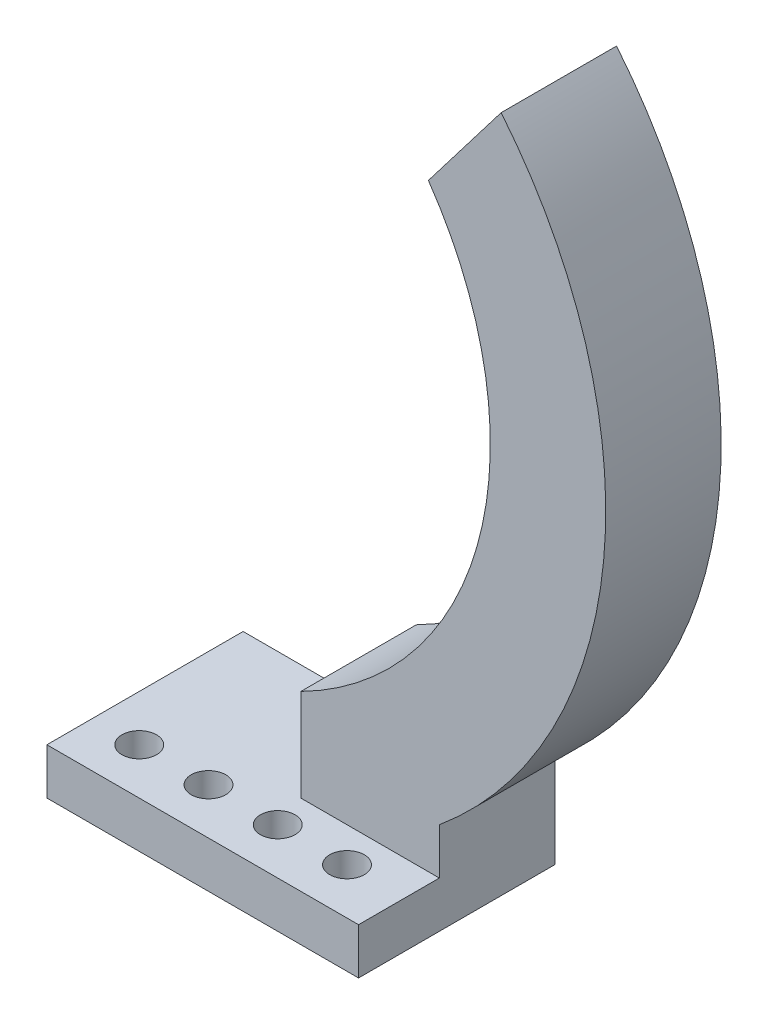
ISO-10303-21;
HEADER;
FILE_DESCRIPTION(('STEP AP214'),'2;1');
FILE_NAME('part.step','',(''),(''),'','','');
FILE_SCHEMA(('AUTOMOTIVE_DESIGN { 1 0 10303 214 1 1 1 1 }'));
ENDSEC;
DATA;
#1=APPLICATION_CONTEXT('core data for automotive mechanical design processes');
#2=APPLICATION_PROTOCOL_DEFINITION('international standard','automotive_design',2000,#1);
#3=PRODUCT_CONTEXT('',#1,'mechanical');
#4=PRODUCT('Part','Part','',(#3));
#5=PRODUCT_RELATED_PRODUCT_CATEGORY('part','',(#4));
#6=PRODUCT_DEFINITION_FORMATION('','',#4);
#7=PRODUCT_DEFINITION_CONTEXT('part definition',#1,'design');
#8=PRODUCT_DEFINITION('design','',#6,#7);
#9=PRODUCT_DEFINITION_SHAPE('','',#8);
#10=(LENGTH_UNIT() NAMED_UNIT(*) SI_UNIT(.MILLI.,.METRE.));
#11=(NAMED_UNIT(*) PLANE_ANGLE_UNIT() SI_UNIT($,.RADIAN.));
#12=(NAMED_UNIT(*) SI_UNIT($,.STERADIAN.) SOLID_ANGLE_UNIT());
#13=UNCERTAINTY_MEASURE_WITH_UNIT(LENGTH_MEASURE(1.E-05),#10,'distance_accuracy_value','');
#14=(GEOMETRIC_REPRESENTATION_CONTEXT(3) GLOBAL_UNCERTAINTY_ASSIGNED_CONTEXT((#13)) GLOBAL_UNIT_ASSIGNED_CONTEXT((#10,
#11,#12)) REPRESENTATION_CONTEXT('',''));
#15=CARTESIAN_POINT('',(0.,0.,0.));
#16=DIRECTION('',(0.,0.,1.));
#17=DIRECTION('',(1.,0.,0.));
#18=AXIS2_PLACEMENT_3D('',#15,#16,#17);
#19=CARTESIAN_POINT('',(0.,0.,10.));
#20=DIRECTION('',(0.,1.,0.));
#21=DIRECTION('',(0.,0.,1.));
#22=AXIS2_PLACEMENT_3D('',#19,#20,#21);
#23=PLANE('',#22);
#24=CARTESIAN_POINT('',(31.,0.,13.));
#25=DIRECTION('',(0.,-1.,0.));
#26=DIRECTION('',(0.,0.,1.));
#27=AXIS2_PLACEMENT_3D('',#24,#25,#26);
#28=CIRCLE('',#27,1.5);
#29=CARTESIAN_POINT('',(31.,0.,14.5));
#30=VERTEX_POINT('',#29);
#31=EDGE_CURVE('E219',#30,#30,#28,.T.);
#32=ORIENTED_EDGE('',*,*,#31,.F.);
#33=EDGE_LOOP('',(#32));
#34=FACE_BOUND('',#33,.T.);
#35=CARTESIAN_POINT('',(37.,0.,13.));
#36=DIRECTION('',(0.,-1.,0.));
#37=DIRECTION('',(0.,0.,1.));
#38=AXIS2_PLACEMENT_3D('',#35,#36,#37);
#39=CIRCLE('',#38,1.5);
#40=CARTESIAN_POINT('',(37.,0.,14.5));
#41=VERTEX_POINT('',#40);
#42=EDGE_CURVE('E213',#41,#41,#39,.T.);
#43=ORIENTED_EDGE('',*,*,#42,.F.);
#44=EDGE_LOOP('',(#43));
#45=FACE_BOUND('',#44,.T.);
#46=CARTESIAN_POINT('',(43.,0.,13.));
#47=DIRECTION('',(0.,-1.,0.));
#48=DIRECTION('',(0.,0.,1.));
#49=AXIS2_PLACEMENT_3D('',#46,#47,#48);
#50=CIRCLE('',#49,1.5);
#51=CARTESIAN_POINT('',(43.,0.,14.5));
#52=VERTEX_POINT('',#51);
#53=EDGE_CURVE('E207',#52,#52,#50,.T.);
#54=ORIENTED_EDGE('',*,*,#53,.F.);
#55=EDGE_LOOP('',(#54));
#56=FACE_BOUND('',#55,.T.);
#57=CARTESIAN_POINT('',(49.,0.,13.));
#58=DIRECTION('',(0.,-1.,0.));
#59=DIRECTION('',(0.,0.,1.));
#60=AXIS2_PLACEMENT_3D('',#57,#58,#59);
#61=CIRCLE('',#60,1.5);
#62=CARTESIAN_POINT('',(49.,0.,14.5));
#63=VERTEX_POINT('',#62);
#64=EDGE_CURVE('E201',#63,#63,#61,.T.);
#65=ORIENTED_EDGE('',*,*,#64,.F.);
#66=EDGE_LOOP('',(#65));
#67=FACE_BOUND('',#66,.T.);
#68=DIRECTION('',(0.,0.,1.));
#69=VECTOR('',#68,1.);
#70=CARTESIAN_POINT('',(27.,0.,10.));
#71=LINE('',#70,#69);
#72=CARTESIAN_POINT('',(27.,0.,0.));
#73=VERTEX_POINT('',#72);
#74=CARTESIAN_POINT('',(27.,0.,17.));
#75=VERTEX_POINT('',#74);
#76=EDGE_CURVE('E52',#73,#75,#71,.T.);
#77=ORIENTED_EDGE('',*,*,#76,.F.);
#78=DIRECTION('',(1.,0.,0.));
#79=VECTOR('',#78,1.);
#80=CARTESIAN_POINT('',(0.,0.,0.));
#81=LINE('',#80,#79);
#82=CARTESIAN_POINT('',(54.,0.,0.));
#83=VERTEX_POINT('',#82);
#84=EDGE_CURVE('E122',#73,#83,#81,.T.);
#85=ORIENTED_EDGE('',*,*,#84,.T.);
#86=DIRECTION('',(0.,0.,-1.));
#87=VECTOR('',#86,1.);
#88=CARTESIAN_POINT('',(54.,0.,10.));
#89=LINE('',#88,#87);
#90=CARTESIAN_POINT('',(54.,0.,17.));
#91=VERTEX_POINT('',#90);
#92=EDGE_CURVE('E171',#91,#83,#89,.T.);
#93=ORIENTED_EDGE('',*,*,#92,.F.);
#94=DIRECTION('',(-1.,0.,0.));
#95=VECTOR('',#94,1.);
#96=CARTESIAN_POINT('',(27.,0.,17.));
#97=LINE('',#96,#95);
#98=EDGE_CURVE('E123',#91,#75,#97,.T.);
#99=ORIENTED_EDGE('',*,*,#98,.T.);
#100=EDGE_LOOP('',(#77,#85,#93,#99));
#101=FACE_BOUND('',#100,.T.);
#102=ADVANCED_FACE('F39',(#34,#45,#56,#67,#101),#23,.F.);
#103=CARTESIAN_POINT('',(0.,3.99999999999999,10.));
#104=DIRECTION('',(0.,1.,0.));
#105=DIRECTION('',(-1.,0.,0.));
#106=AXIS2_PLACEMENT_3D('',#103,#104,#105);
#107=PLANE('',#106);
#108=CARTESIAN_POINT('',(31.,3.99999999999999,13.));
#109=DIRECTION('',(0.,-1.,0.));
#110=DIRECTION('',(0.,0.,1.));
#111=AXIS2_PLACEMENT_3D('',#108,#109,#110);
#112=CIRCLE('',#111,1.5);
#113=CARTESIAN_POINT('',(31.,3.99999999999999,14.5));
#114=VERTEX_POINT('',#113);
#115=EDGE_CURVE('E198',#114,#114,#112,.T.);
#116=ORIENTED_EDGE('',*,*,#115,.T.);
#117=EDGE_LOOP('',(#116));
#118=FACE_BOUND('',#117,.T.);
#119=CARTESIAN_POINT('',(37.,3.99999999999999,13.));
#120=DIRECTION('',(0.,-1.,0.));
#121=DIRECTION('',(0.,0.,1.));
#122=AXIS2_PLACEMENT_3D('',#119,#120,#121);
#123=CIRCLE('',#122,1.5);
#124=CARTESIAN_POINT('',(37.,3.99999999999999,14.5));
#125=VERTEX_POINT('',#124);
#126=EDGE_CURVE('E216',#125,#125,#123,.T.);
#127=ORIENTED_EDGE('',*,*,#126,.T.);
#128=EDGE_LOOP('',(#127));
#129=FACE_BOUND('',#128,.T.);
#130=CARTESIAN_POINT('',(43.,3.99999999999999,13.));
#131=DIRECTION('',(0.,-1.,0.));
#132=DIRECTION('',(0.,0.,1.));
#133=AXIS2_PLACEMENT_3D('',#130,#131,#132);
#134=CIRCLE('',#133,1.5);
#135=CARTESIAN_POINT('',(43.,3.99999999999999,14.5));
#136=VERTEX_POINT('',#135);
#137=EDGE_CURVE('E210',#136,#136,#134,.T.);
#138=ORIENTED_EDGE('',*,*,#137,.T.);
#139=EDGE_LOOP('',(#138));
#140=FACE_BOUND('',#139,.T.);
#141=CARTESIAN_POINT('',(49.,3.99999999999999,13.));
#142=DIRECTION('',(0.,-1.,0.));
#143=DIRECTION('',(0.,0.,1.));
#144=AXIS2_PLACEMENT_3D('',#141,#142,#143);
#145=CIRCLE('',#144,1.5);
#146=CARTESIAN_POINT('',(49.,3.99999999999999,14.5));
#147=VERTEX_POINT('',#146);
#148=EDGE_CURVE('E204',#147,#147,#145,.T.);
#149=ORIENTED_EDGE('',*,*,#148,.T.);
#150=EDGE_LOOP('',(#149));
#151=FACE_BOUND('',#150,.T.);
#152=DIRECTION('',(1.,0.,0.));
#153=VECTOR('',#152,1.);
#154=CARTESIAN_POINT('',(0.,3.99999999999999,0.));
#155=LINE('',#154,#153);
#156=CARTESIAN_POINT('',(27.,4.00000000000001,0.));
#157=VERTEX_POINT('',#156);
#158=CARTESIAN_POINT('',(42.,4.,0.));
#159=VERTEX_POINT('',#158);
#160=EDGE_CURVE('E117',#157,#159,#155,.T.);
#161=ORIENTED_EDGE('',*,*,#160,.F.);
#162=DIRECTION('',(0.,0.,1.));
#163=VECTOR('',#162,1.);
#164=CARTESIAN_POINT('',(27.,4.00000000000001,10.));
#165=LINE('',#164,#163);
#166=CARTESIAN_POINT('',(27.,4.,17.));
#167=VERTEX_POINT('',#166);
#168=EDGE_CURVE('E107',#157,#167,#165,.T.);
#169=ORIENTED_EDGE('',*,*,#168,.T.);
#170=DIRECTION('',(1.,0.,0.));
#171=VECTOR('',#170,1.);
#172=CARTESIAN_POINT('',(0.,4.,17.));
#173=LINE('',#172,#171);
#174=CARTESIAN_POINT('',(54.,4.,17.));
#175=VERTEX_POINT('',#174);
#176=EDGE_CURVE('E114',#167,#175,#173,.T.);
#177=ORIENTED_EDGE('',*,*,#176,.T.);
#178=DIRECTION('',(0.,0.,-1.));
#179=VECTOR('',#178,1.);
#180=CARTESIAN_POINT('',(54.,4.,17.));
#181=LINE('',#180,#179);
#182=CARTESIAN_POINT('',(54.,4.,10.));
#183=VERTEX_POINT('',#182);
#184=EDGE_CURVE('E60',#175,#183,#181,.T.);
#185=ORIENTED_EDGE('',*,*,#184,.T.);
#186=DIRECTION('',(1.,0.,0.));
#187=VECTOR('',#186,1.);
#188=CARTESIAN_POINT('',(54.,4.,10.));
#189=LINE('',#188,#187);
#190=CARTESIAN_POINT('',(42.,4.,10.));
#191=VERTEX_POINT('',#190);
#192=EDGE_CURVE('E46',#191,#183,#189,.T.);
#193=ORIENTED_EDGE('',*,*,#192,.F.);
#194=DIRECTION('',(0.,0.,-1.));
#195=VECTOR('',#194,1.);
#196=CARTESIAN_POINT('',(42.,4.,10.));
#197=LINE('',#196,#195);
#198=EDGE_CURVE('E173',#191,#159,#197,.T.);
#199=ORIENTED_EDGE('',*,*,#198,.T.);
#200=EDGE_LOOP('',(#161,#169,#177,#185,#193,#199));
#201=FACE_BOUND('',#200,.T.);
#202=ADVANCED_FACE('F113',(#118,#129,#140,#151,#201),#107,.T.);
#203=CARTESIAN_POINT('',(0.,0.,0.));
#204=DIRECTION('',(0.,0.,1.));
#205=DIRECTION('',(1.,0.,0.));
#206=AXIS2_PLACEMENT_3D('',#203,#204,#205);
#207=PLANE('',#206);
#208=DIRECTION('',(0.,-1.,0.));
#209=VECTOR('',#208,1.);
#210=CARTESIAN_POINT('',(27.,0.,0.));
#211=LINE('',#210,#209);
#212=EDGE_CURVE('E195',#157,#73,#211,.T.);
#213=ORIENTED_EDGE('',*,*,#212,.F.);
#214=ORIENTED_EDGE('',*,*,#160,.T.);
#215=DIRECTION('',(0.,-1.,0.));
#216=VECTOR('',#215,1.);
#217=CARTESIAN_POINT('',(42.,0.,0.));
#218=LINE('',#217,#216);
#219=CARTESIAN_POINT('',(42.,12.,0.));
#220=VERTEX_POINT('',#219);
#221=EDGE_CURVE('E159',#220,#159,#218,.T.);
#222=ORIENTED_EDGE('',*,*,#221,.F.);
#223=CARTESIAN_POINT('',(28.4161458129867,38.7484374389601,0.));
#224=DIRECTION('',(0.,0.,-1.));
#225=DIRECTION('',(-1.,0.,0.));
#226=AXIS2_PLACEMENT_3D('',#223,#224,#225);
#227=CIRCLE('',#226,30.);
#228=CARTESIAN_POINT('',(53.0522045533126,55.8675673743047,0.));
#229=VERTEX_POINT('',#228);
#230=EDGE_CURVE('E157',#229,#220,#227,.T.);
#231=ORIENTED_EDGE('',*,*,#230,.F.);
#232=DIRECTION('',(-0.607706195574295,-0.794161935539986,0.));
#233=VECTOR('',#232,1.);
#234=CARTESIAN_POINT('',(26.4395869324586,21.0896959728289,0.));
#235=LINE('',#234,#233);
#236=CARTESIAN_POINT('',(59.3540139754706,64.1028909641451,0.));
#237=VERTEX_POINT('',#236);
#238=EDGE_CURVE('E154',#237,#229,#235,.T.);
#239=ORIENTED_EDGE('',*,*,#238,.F.);
#240=CARTESIAN_POINT('',(28.4161458129867,38.7484374389601,0.));
#241=DIRECTION('',(0.,0.,-1.));
#242=DIRECTION('',(-1.,0.,0.));
#243=AXIS2_PLACEMENT_3D('',#240,#241,#242);
#244=CIRCLE('',#243,40.);
#245=CARTESIAN_POINT('',(54.,8.,0.));
#246=VERTEX_POINT('',#245);
#247=EDGE_CURVE('E165',#237,#246,#244,.T.);
#248=ORIENTED_EDGE('',*,*,#247,.T.);
#249=DIRECTION('',(0.,-1.,0.));
#250=VECTOR('',#249,1.);
#251=CARTESIAN_POINT('',(54.,0.,0.));
#252=LINE('',#251,#250);
#253=EDGE_CURVE('E162',#246,#83,#252,.T.);
#254=ORIENTED_EDGE('',*,*,#253,.T.);
#255=ORIENTED_EDGE('',*,*,#84,.F.);
#256=EDGE_LOOP('',(#213,#214,#222,#231,#239,#248,#254,#255));
#257=FACE_BOUND('',#256,.T.);
#258=ADVANCED_FACE('F189',(#257),#207,.F.);
#259=CARTESIAN_POINT('',(0.,0.,17.));
#260=DIRECTION('',(0.,0.,-1.));
#261=DIRECTION('',(-1.,0.,0.));
#262=AXIS2_PLACEMENT_3D('',#259,#260,#261);
#263=PLANE('',#262);
#264=DIRECTION('',(0.,1.,0.));
#265=VECTOR('',#264,1.);
#266=CARTESIAN_POINT('',(27.,0.,17.));
#267=LINE('',#266,#265);
#268=EDGE_CURVE('E11',#75,#167,#267,.T.);
#269=ORIENTED_EDGE('',*,*,#268,.F.);
#270=ORIENTED_EDGE('',*,*,#98,.F.);
#271=DIRECTION('',(0.,1.,0.));
#272=VECTOR('',#271,1.);
#273=CARTESIAN_POINT('',(54.,0.,17.));
#274=LINE('',#273,#272);
#275=EDGE_CURVE('E121',#91,#175,#274,.T.);
#276=ORIENTED_EDGE('',*,*,#275,.T.);
#277=ORIENTED_EDGE('',*,*,#176,.F.);
#278=EDGE_LOOP('',(#269,#270,#276,#277));
#279=FACE_BOUND('',#278,.T.);
#280=ADVANCED_FACE('F119',(#279),#263,.F.);
#281=CARTESIAN_POINT('',(54.,0.,10.));
#282=DIRECTION('',(0.,0.,1.));
#283=DIRECTION('',(-1.,0.,0.));
#284=AXIS2_PLACEMENT_3D('',#281,#282,#283);
#285=PLANE('',#284);
#286=DIRECTION('',(0.,-1.,0.));
#287=VECTOR('',#286,1.);
#288=CARTESIAN_POINT('',(42.,0.,10.));
#289=LINE('',#288,#287);
#290=CARTESIAN_POINT('',(42.,12.,10.));
#291=VERTEX_POINT('',#290);
#292=EDGE_CURVE('E139',#291,#191,#289,.T.);
#293=ORIENTED_EDGE('',*,*,#292,.T.);
#294=ORIENTED_EDGE('',*,*,#192,.T.);
#295=DIRECTION('',(0.,-1.,0.));
#296=VECTOR('',#295,1.);
#297=CARTESIAN_POINT('',(54.,0.,10.));
#298=LINE('',#297,#296);
#299=CARTESIAN_POINT('',(54.,8.,10.));
#300=VERTEX_POINT('',#299);
#301=EDGE_CURVE('E136',#300,#183,#298,.T.);
#302=ORIENTED_EDGE('',*,*,#301,.F.);
#303=CARTESIAN_POINT('',(28.4161458129867,38.7484374389601,10.));
#304=DIRECTION('',(0.,0.,-1.));
#305=DIRECTION('',(-1.,0.,0.));
#306=AXIS2_PLACEMENT_3D('',#303,#304,#305);
#307=CIRCLE('',#306,40.);
#308=CARTESIAN_POINT('',(59.3540139754706,64.1028909641451,10.));
#309=VERTEX_POINT('',#308);
#310=EDGE_CURVE('E146',#309,#300,#307,.T.);
#311=ORIENTED_EDGE('',*,*,#310,.F.);
#312=DIRECTION('',(-0.607706195574295,-0.794161935539986,0.));
#313=VECTOR('',#312,1.);
#314=CARTESIAN_POINT('',(26.4395869324586,21.0896959728289,10.));
#315=LINE('',#314,#313);
#316=CARTESIAN_POINT('',(53.0522045533126,55.8675673743047,10.));
#317=VERTEX_POINT('',#316);
#318=EDGE_CURVE('E168',#309,#317,#315,.T.);
#319=ORIENTED_EDGE('',*,*,#318,.T.);
#320=CARTESIAN_POINT('',(28.4161458129867,38.7484374389601,10.));
#321=DIRECTION('',(0.,0.,-1.));
#322=DIRECTION('',(-1.,0.,0.));
#323=AXIS2_PLACEMENT_3D('',#320,#321,#322);
#324=CIRCLE('',#323,30.);
#325=EDGE_CURVE('E150',#317,#291,#324,.T.);
#326=ORIENTED_EDGE('',*,*,#325,.T.);
#327=EDGE_LOOP('',(#293,#294,#302,#311,#319,#326));
#328=FACE_BOUND('',#327,.T.);
#329=ADVANCED_FACE('F134',(#328),#285,.T.);
#330=CARTESIAN_POINT('',(26.4395869324586,21.0896959728289,10.));
#331=DIRECTION('',(0.794161935539986,-0.607706195574295,0.));
#332=DIRECTION('',(0.607706195574295,0.794161935539986,0.));
#333=AXIS2_PLACEMENT_3D('',#330,#331,#332);
#334=PLANE('',#333);
#335=ORIENTED_EDGE('',*,*,#238,.T.);
#336=DIRECTION('',(0.,0.,-1.));
#337=VECTOR('',#336,1.);
#338=CARTESIAN_POINT('',(53.0522045533126,55.8675673743047,10.));
#339=LINE('',#338,#337);
#340=EDGE_CURVE('E126',#317,#229,#339,.T.);
#341=ORIENTED_EDGE('',*,*,#340,.F.);
#342=ORIENTED_EDGE('',*,*,#318,.F.);
#343=DIRECTION('',(0.,0.,-1.));
#344=VECTOR('',#343,1.);
#345=CARTESIAN_POINT('',(59.3540139754706,64.1028909641451,10.));
#346=LINE('',#345,#344);
#347=EDGE_CURVE('E148',#309,#237,#346,.T.);
#348=ORIENTED_EDGE('',*,*,#347,.T.);
#349=EDGE_LOOP('',(#335,#341,#342,#348));
#350=FACE_BOUND('',#349,.T.);
#351=ADVANCED_FACE('F186',(#350),#334,.F.);
#352=CARTESIAN_POINT('',(28.4161458129867,38.7484374389601,10.));
#353=DIRECTION('',(0.,0.,-1.));
#354=DIRECTION('',(-1.,0.,0.));
#355=AXIS2_PLACEMENT_3D('',#352,#353,#354);
#356=CYLINDRICAL_SURFACE('',#355,30.);
#357=ORIENTED_EDGE('',*,*,#230,.T.);
#358=DIRECTION('',(0.,0.,-1.));
#359=VECTOR('',#358,1.);
#360=CARTESIAN_POINT('',(42.,12.,10.));
#361=LINE('',#360,#359);
#362=EDGE_CURVE('E175',#291,#220,#361,.T.);
#363=ORIENTED_EDGE('',*,*,#362,.F.);
#364=ORIENTED_EDGE('',*,*,#325,.F.);
#365=ORIENTED_EDGE('',*,*,#340,.T.);
#366=EDGE_LOOP('',(#357,#363,#364,#365));
#367=FACE_BOUND('',#366,.T.);
#368=ADVANCED_FACE('F180',(#367),#356,.F.);
#369=CARTESIAN_POINT('',(42.,0.,10.));
#370=DIRECTION('',(1.,0.,0.));
#371=DIRECTION('',(0.,1.,0.));
#372=AXIS2_PLACEMENT_3D('',#369,#370,#371);
#373=PLANE('',#372);
#374=ORIENTED_EDGE('',*,*,#221,.T.);
#375=ORIENTED_EDGE('',*,*,#198,.F.);
#376=ORIENTED_EDGE('',*,*,#292,.F.);
#377=ORIENTED_EDGE('',*,*,#362,.T.);
#378=EDGE_LOOP('',(#374,#375,#376,#377));
#379=FACE_BOUND('',#378,.T.);
#380=ADVANCED_FACE('F227',(#379),#373,.F.);
#381=CARTESIAN_POINT('',(54.,0.,10.));
#382=DIRECTION('',(1.,0.,0.));
#383=DIRECTION('',(0.,1.,0.));
#384=AXIS2_PLACEMENT_3D('',#381,#382,#383);
#385=PLANE('',#384);
#386=ORIENTED_EDGE('',*,*,#92,.T.);
#387=ORIENTED_EDGE('',*,*,#253,.F.);
#388=DIRECTION('',(0.,0.,-1.));
#389=VECTOR('',#388,1.);
#390=CARTESIAN_POINT('',(54.,8.,10.));
#391=LINE('',#390,#389);
#392=EDGE_CURVE('E145',#300,#246,#391,.T.);
#393=ORIENTED_EDGE('',*,*,#392,.F.);
#394=ORIENTED_EDGE('',*,*,#301,.T.);
#395=ORIENTED_EDGE('',*,*,#184,.F.);
#396=ORIENTED_EDGE('',*,*,#275,.F.);
#397=EDGE_LOOP('',(#386,#387,#393,#394,#395,#396));
#398=FACE_BOUND('',#397,.T.);
#399=ADVANCED_FACE('F143',(#398),#385,.T.);
#400=CARTESIAN_POINT('',(28.4161458129867,38.7484374389601,10.));
#401=DIRECTION('',(0.,0.,-1.));
#402=DIRECTION('',(-1.,0.,0.));
#403=AXIS2_PLACEMENT_3D('',#400,#401,#402);
#404=CYLINDRICAL_SURFACE('',#403,40.);
#405=ORIENTED_EDGE('',*,*,#247,.F.);
#406=ORIENTED_EDGE('',*,*,#347,.F.);
#407=ORIENTED_EDGE('',*,*,#310,.T.);
#408=ORIENTED_EDGE('',*,*,#392,.T.);
#409=EDGE_LOOP('',(#405,#406,#407,#408));
#410=FACE_BOUND('',#409,.T.);
#411=ADVANCED_FACE('F192',(#410),#404,.T.);
#412=CARTESIAN_POINT('',(31.,0.,13.));
#413=DIRECTION('',(0.,1.,0.));
#414=DIRECTION('',(0.,0.,1.));
#415=AXIS2_PLACEMENT_3D('',#412,#413,#414);
#416=CYLINDRICAL_SURFACE('',#415,1.5);
#417=ORIENTED_EDGE('',*,*,#31,.T.);
#418=EDGE_LOOP('',(#417));
#419=FACE_BOUND('',#418,.T.);
#420=ORIENTED_EDGE('',*,*,#115,.F.);
#421=EDGE_LOOP('',(#420));
#422=FACE_BOUND('',#421,.T.);
#423=ADVANCED_FACE('F268',(#419,#422),#416,.F.);
#424=CARTESIAN_POINT('',(37.,0.,13.));
#425=DIRECTION('',(0.,1.,0.));
#426=DIRECTION('',(0.,0.,1.));
#427=AXIS2_PLACEMENT_3D('',#424,#425,#426);
#428=CYLINDRICAL_SURFACE('',#427,1.5);
#429=ORIENTED_EDGE('',*,*,#42,.T.);
#430=EDGE_LOOP('',(#429));
#431=FACE_BOUND('',#430,.T.);
#432=ORIENTED_EDGE('',*,*,#126,.F.);
#433=EDGE_LOOP('',(#432));
#434=FACE_BOUND('',#433,.T.);
#435=ADVANCED_FACE('F262',(#431,#434),#428,.F.);
#436=CARTESIAN_POINT('',(43.,0.,13.));
#437=DIRECTION('',(0.,1.,0.));
#438=DIRECTION('',(0.,0.,1.));
#439=AXIS2_PLACEMENT_3D('',#436,#437,#438);
#440=CYLINDRICAL_SURFACE('',#439,1.5);
#441=ORIENTED_EDGE('',*,*,#53,.T.);
#442=EDGE_LOOP('',(#441));
#443=FACE_BOUND('',#442,.T.);
#444=ORIENTED_EDGE('',*,*,#137,.F.);
#445=EDGE_LOOP('',(#444));
#446=FACE_BOUND('',#445,.T.);
#447=ADVANCED_FACE('F253',(#443,#446),#440,.F.);
#448=CARTESIAN_POINT('',(49.,0.,13.));
#449=DIRECTION('',(0.,1.,0.));
#450=DIRECTION('',(0.,0.,1.));
#451=AXIS2_PLACEMENT_3D('',#448,#449,#450);
#452=CYLINDRICAL_SURFACE('',#451,1.5);
#453=ORIENTED_EDGE('',*,*,#64,.T.);
#454=EDGE_LOOP('',(#453));
#455=FACE_BOUND('',#454,.T.);
#456=ORIENTED_EDGE('',*,*,#148,.F.);
#457=EDGE_LOOP('',(#456));
#458=FACE_BOUND('',#457,.T.);
#459=ADVANCED_FACE('F250',(#455,#458),#452,.F.);
#460=CARTESIAN_POINT('',(27.,0.,0.));
#461=DIRECTION('',(-1.,0.,0.));
#462=DIRECTION('',(0.,-1.,0.));
#463=AXIS2_PLACEMENT_3D('',#460,#461,#462);
#464=PLANE('',#463);
#465=ORIENTED_EDGE('',*,*,#212,.T.);
#466=ORIENTED_EDGE('',*,*,#76,.T.);
#467=ORIENTED_EDGE('',*,*,#268,.T.);
#468=ORIENTED_EDGE('',*,*,#168,.F.);
#469=EDGE_LOOP('',(#465,#466,#467,#468));
#470=FACE_BOUND('',#469,.T.);
#471=ADVANCED_FACE('F106',(#470),#464,.T.);
#472=CLOSED_SHELL('',(#102,#202,#258,#280,#329,#351,#368,#380,#399,#411,#423,#435,#447,#459,#471));
#473=MANIFOLD_SOLID_BREP('B2',#472);
#474=ADVANCED_BREP_SHAPE_REPRESENTATION('',(#18,#473),#14);
#475=SHAPE_DEFINITION_REPRESENTATION(#9,#474);
ENDSEC;
END-ISO-10303-21;
